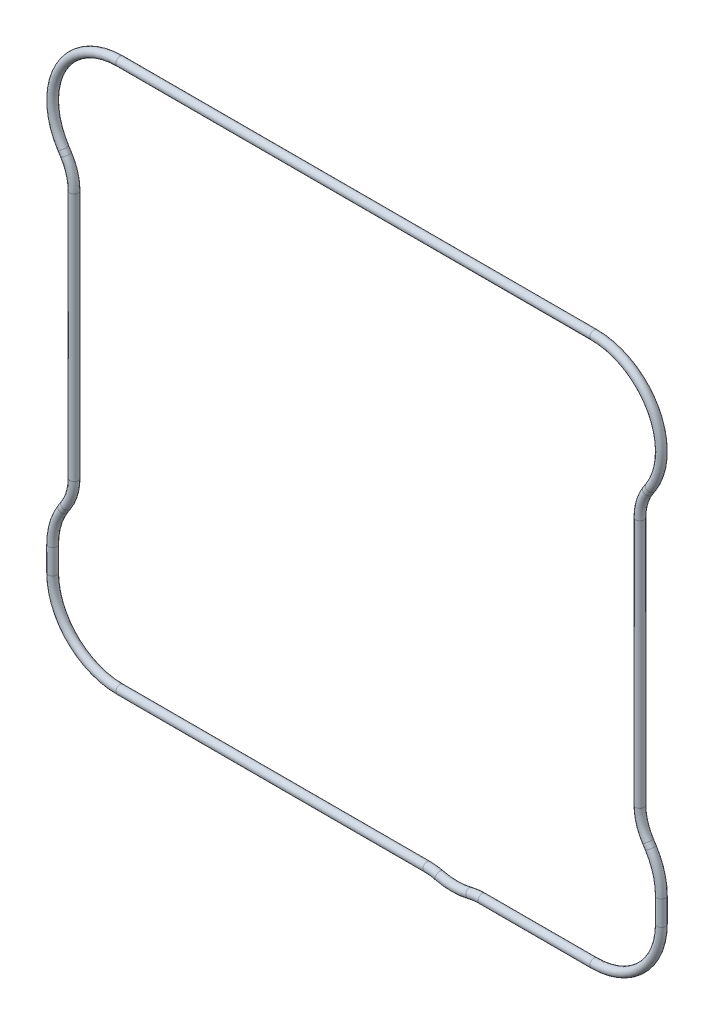
ISO-10303-21;
HEADER;
FILE_DESCRIPTION(('STEP AP214'),'2;1');
FILE_NAME('part.step','',(''),(''),'','','');
FILE_SCHEMA(('AUTOMOTIVE_DESIGN { 1 0 10303 214 1 1 1 1 }'));
ENDSEC;
DATA;
#1=APPLICATION_CONTEXT('core data for automotive mechanical design processes');
#2=APPLICATION_PROTOCOL_DEFINITION('international standard','automotive_design',2000,#1);
#3=PRODUCT_CONTEXT('',#1,'mechanical');
#4=PRODUCT('Part','Part','',(#3));
#5=PRODUCT_RELATED_PRODUCT_CATEGORY('part','',(#4));
#6=PRODUCT_DEFINITION_FORMATION('','',#4);
#7=PRODUCT_DEFINITION_CONTEXT('part definition',#1,'design');
#8=PRODUCT_DEFINITION('design','',#6,#7);
#9=PRODUCT_DEFINITION_SHAPE('','',#8);
#10=(LENGTH_UNIT() NAMED_UNIT(*) SI_UNIT(.MILLI.,.METRE.));
#11=(NAMED_UNIT(*) PLANE_ANGLE_UNIT() SI_UNIT($,.RADIAN.));
#12=(NAMED_UNIT(*) SI_UNIT($,.STERADIAN.) SOLID_ANGLE_UNIT());
#13=UNCERTAINTY_MEASURE_WITH_UNIT(LENGTH_MEASURE(1.E-05),#10,'distance_accuracy_value','');
#14=(GEOMETRIC_REPRESENTATION_CONTEXT(3) GLOBAL_UNCERTAINTY_ASSIGNED_CONTEXT((#13)) GLOBAL_UNIT_ASSIGNED_CONTEXT((#10,
#11,#12)) REPRESENTATION_CONTEXT('',''));
#15=CARTESIAN_POINT('',(0.,0.,0.));
#16=DIRECTION('',(0.,0.,1.));
#17=DIRECTION('',(1.,0.,0.));
#18=AXIS2_PLACEMENT_3D('',#15,#16,#17);
#19=CARTESIAN_POINT('',(119.575,44.6459755167523,0.));
#20=DIRECTION('',(0.,0.,1.));
#21=DIRECTION('',(1.,0.,0.));
#22=AXIS2_PLACEMENT_3D('',#19,#20,#21);
#23=TOROIDAL_SURFACE('',#22,18.1,1.5);
#24=CARTESIAN_POINT('',(104.331657726848,54.4056126177692,0.));
#25=DIRECTION('',(0.539206469669447,0.842173606251474,0.));
#26=DIRECTION('',(0.,0.,1.));
#27=AXIS2_PLACEMENT_3D('',#24,#25,#26);
#28=CIRCLE('',#27,1.5);
#29=CARTESIAN_POINT('',(103.068397317471,55.2144223222734,0.));
#30=VERTEX_POINT('',#29);
#31=EDGE_CURVE('E44',#30,#30,#28,.T.);
#32=CARTESIAN_POINT('',(101.475,44.6459755167522,0.));
#33=DIRECTION('',(0.,1.,0.));
#34=DIRECTION('',(0.,0.,1.));
#35=AXIS2_PLACEMENT_3D('',#32,#33,#34);
#36=CIRCLE('',#35,1.5);
#37=CARTESIAN_POINT('',(99.975,44.6459755167522,0.));
#38=VERTEX_POINT('',#37);
#39=EDGE_CURVE('E10',#38,#38,#36,.T.);
#40=CARTESIAN_POINT('',(119.575,44.6459755167523,0.));
#41=DIRECTION('',(0.,0.,1.));
#42=DIRECTION('',(1.,0.,0.));
#43=AXIS2_PLACEMENT_3D('',#40,#41,#42);
#44=CIRCLE('',#43,19.6);
#45=EDGE_CURVE('',#30,#38,#44,.T.);
#46=ORIENTED_EDGE('',*,*,#31,.F.);
#47=ORIENTED_EDGE('',*,*,#39,.T.);
#48=ORIENTED_EDGE('',*,*,#45,.T.);
#49=ORIENTED_EDGE('',*,*,#45,.F.);
#50=EDGE_LOOP('',(#46,#48,#47,#49));
#51=FACE_BOUND('',#50,.T.);
#52=ADVANCED_FACE('F38',(#51),#23,.T.);
#53=CARTESIAN_POINT('',(105.338492590973,55.9781637574828,0.));
#54=DIRECTION('',(-0.539206469669446,-0.842173606251474,0.));
#55=DIRECTION('',(0.842173606251474,-0.539206469669446,0.));
#56=AXIS2_PLACEMENT_3D('',#53,#54,#55);
#57=CYLINDRICAL_SURFACE('',#56,1.5);
#58=CARTESIAN_POINT('',(105.338492590973,55.9781637574828,0.));
#59=DIRECTION('',(0.539206469669447,0.842173606251474,0.));
#60=DIRECTION('',(0.,0.,1.));
#61=AXIS2_PLACEMENT_3D('',#58,#59,#60);
#62=CIRCLE('',#61,1.5);
#63=CARTESIAN_POINT('',(106.60175300035,55.1693540529786,0.));
#64=VERTEX_POINT('',#63);
#65=EDGE_CURVE('E48',#64,#64,#62,.T.);
#66=ORIENTED_EDGE('',*,*,#65,.F.);
#67=EDGE_LOOP('',(#66));
#68=FACE_BOUND('',#67,.T.);
#69=ORIENTED_EDGE('',*,*,#31,.T.);
#70=EDGE_LOOP('',(#69));
#71=FACE_BOUND('',#70,.T.);
#72=ADVANCED_FACE('F244',(#68,#71),#57,.T.);
#73=CARTESIAN_POINT('',(85.,69.,0.));
#74=DIRECTION('',(0.,0.,-1.));
#75=DIRECTION('',(-1.,0.,0.));
#76=AXIS2_PLACEMENT_3D('',#73,#74,#75);
#77=TOROIDAL_SURFACE('',#76,24.1499999999999,1.5);
#78=CARTESIAN_POINT('',(85.0000000000001,93.1499999999999,0.));
#79=DIRECTION('',(-1.,0.,0.));
#80=DIRECTION('',(0.,0.,1.));
#81=AXIS2_PLACEMENT_3D('',#78,#79,#80);
#82=CIRCLE('',#81,1.5);
#83=CARTESIAN_POINT('',(85.0000000000001,94.6499999999999,0.));
#84=VERTEX_POINT('',#83);
#85=EDGE_CURVE('E52',#84,#84,#82,.T.);
#86=CARTESIAN_POINT('',(85.,69.,0.));
#87=DIRECTION('',(0.,0.,-1.));
#88=DIRECTION('',(-1.,0.,0.));
#89=AXIS2_PLACEMENT_3D('',#86,#87,#88);
#90=CIRCLE('',#89,25.6499999999999);
#91=EDGE_CURVE('',#84,#64,#90,.T.);
#92=ORIENTED_EDGE('',*,*,#85,.F.);
#93=ORIENTED_EDGE('',*,*,#65,.T.);
#94=ORIENTED_EDGE('',*,*,#91,.T.);
#95=ORIENTED_EDGE('',*,*,#91,.F.);
#96=EDGE_LOOP('',(#92,#94,#93,#95));
#97=FACE_BOUND('',#96,.T.);
#98=ADVANCED_FACE('F238',(#97),#77,.T.);
#99=CARTESIAN_POINT('',(-84.9999999999999,93.1499999999999,0.));
#100=DIRECTION('',(1.,0.,0.));
#101=DIRECTION('',(0.,0.,-1.));
#102=AXIS2_PLACEMENT_3D('',#99,#100,#101);
#103=CYLINDRICAL_SURFACE('',#102,1.5);
#104=CARTESIAN_POINT('',(-84.9999999999999,93.1499999999999,0.));
#105=DIRECTION('',(-1.,0.,0.));
#106=DIRECTION('',(0.,0.,1.));
#107=AXIS2_PLACEMENT_3D('',#104,#105,#106);
#108=CIRCLE('',#107,1.5);
#109=CARTESIAN_POINT('',(-84.9999999999999,94.6499999999999,0.));
#110=VERTEX_POINT('',#109);
#111=EDGE_CURVE('E57',#110,#110,#108,.T.);
#112=ORIENTED_EDGE('',*,*,#111,.F.);
#113=EDGE_LOOP('',(#112));
#114=FACE_BOUND('',#113,.T.);
#115=ORIENTED_EDGE('',*,*,#85,.T.);
#116=EDGE_LOOP('',(#115));
#117=FACE_BOUND('',#116,.T.);
#118=ADVANCED_FACE('F232',(#114,#117),#103,.T.);
#119=CARTESIAN_POINT('',(-85.,69.,0.));
#120=DIRECTION('',(0.,0.,-1.));
#121=DIRECTION('',(-1.,0.,0.));
#122=AXIS2_PLACEMENT_3D('',#119,#120,#121);
#123=TOROIDAL_SURFACE('',#122,24.1499999999999,1.5);
#124=CARTESIAN_POINT('',(-105.338492590973,55.9781637574829,0.));
#125=DIRECTION('',(0.539206469669451,-0.842173606251471,0.));
#126=DIRECTION('',(0.,0.,1.));
#127=AXIS2_PLACEMENT_3D('',#124,#125,#126);
#128=CIRCLE('',#127,1.5);
#129=CARTESIAN_POINT('',(-106.60175300035,55.1693540529787,0.));
#130=VERTEX_POINT('',#129);
#131=EDGE_CURVE('E60',#130,#130,#128,.T.);
#132=CARTESIAN_POINT('',(-85.,69.,0.));
#133=DIRECTION('',(0.,0.,-1.));
#134=DIRECTION('',(-1.,0.,0.));
#135=AXIS2_PLACEMENT_3D('',#132,#133,#134);
#136=CIRCLE('',#135,25.6499999999999);
#137=EDGE_CURVE('',#130,#110,#136,.T.);
#138=ORIENTED_EDGE('',*,*,#131,.F.);
#139=ORIENTED_EDGE('',*,*,#111,.T.);
#140=ORIENTED_EDGE('',*,*,#137,.T.);
#141=ORIENTED_EDGE('',*,*,#137,.F.);
#142=EDGE_LOOP('',(#138,#140,#139,#141));
#143=FACE_BOUND('',#142,.T.);
#144=ADVANCED_FACE('F226',(#143),#123,.T.);
#145=CARTESIAN_POINT('',(-104.331657726848,54.4056126177694,0.));
#146=DIRECTION('',(-0.539206469669453,0.84217360625147,0.));
#147=DIRECTION('',(-0.84217360625147,-0.539206469669453,0.));
#148=AXIS2_PLACEMENT_3D('',#145,#146,#147);
#149=CYLINDRICAL_SURFACE('',#148,1.5);
#150=CARTESIAN_POINT('',(-104.331657726848,54.4056126177694,0.));
#151=DIRECTION('',(0.539206469669451,-0.842173606251471,0.));
#152=DIRECTION('',(0.,0.,1.));
#153=AXIS2_PLACEMENT_3D('',#150,#151,#152);
#154=CIRCLE('',#153,1.5);
#155=CARTESIAN_POINT('',(-103.068397317471,55.2144223222735,0.));
#156=VERTEX_POINT('',#155);
#157=EDGE_CURVE('E63',#156,#156,#154,.T.);
#158=ORIENTED_EDGE('',*,*,#157,.F.);
#159=EDGE_LOOP('',(#158));
#160=FACE_BOUND('',#159,.T.);
#161=ORIENTED_EDGE('',*,*,#131,.T.);
#162=EDGE_LOOP('',(#161));
#163=FACE_BOUND('',#162,.T.);
#164=ADVANCED_FACE('F220',(#160,#163),#149,.T.);
#165=CARTESIAN_POINT('',(-119.575,44.6459755167523,0.));
#166=DIRECTION('',(0.,0.,1.));
#167=DIRECTION('',(1.,0.,0.));
#168=AXIS2_PLACEMENT_3D('',#165,#166,#167);
#169=TOROIDAL_SURFACE('',#168,18.1000000000001,1.5);
#170=CARTESIAN_POINT('',(-101.475,44.6459755167523,0.));
#171=DIRECTION('',(0.,-1.,0.));
#172=DIRECTION('',(0.,0.,1.));
#173=AXIS2_PLACEMENT_3D('',#170,#171,#172);
#174=CIRCLE('',#173,1.5);
#175=CARTESIAN_POINT('',(-99.9749999999999,44.6459755167523,0.));
#176=VERTEX_POINT('',#175);
#177=EDGE_CURVE('E66',#176,#176,#174,.T.);
#178=CARTESIAN_POINT('',(-119.575,44.6459755167523,0.));
#179=DIRECTION('',(0.,0.,1.));
#180=DIRECTION('',(1.,0.,0.));
#181=AXIS2_PLACEMENT_3D('',#178,#179,#180);
#182=CIRCLE('',#181,19.6000000000001);
#183=EDGE_CURVE('',#176,#156,#182,.T.);
#184=ORIENTED_EDGE('',*,*,#177,.F.);
#185=ORIENTED_EDGE('',*,*,#157,.T.);
#186=ORIENTED_EDGE('',*,*,#183,.T.);
#187=ORIENTED_EDGE('',*,*,#183,.F.);
#188=EDGE_LOOP('',(#184,#186,#185,#187));
#189=FACE_BOUND('',#188,.T.);
#190=ADVANCED_FACE('F214',(#189),#169,.T.);
#191=CARTESIAN_POINT('',(-101.475,-44.6459755167522,0.));
#192=DIRECTION('',(0.,1.,0.));
#193=DIRECTION('',(-1.,0.,0.));
#194=AXIS2_PLACEMENT_3D('',#191,#192,#193);
#195=CYLINDRICAL_SURFACE('',#194,1.5);
#196=CARTESIAN_POINT('',(-101.475,-44.6459755167522,0.));
#197=DIRECTION('',(0.,-1.,0.));
#198=DIRECTION('',(0.,0.,1.));
#199=AXIS2_PLACEMENT_3D('',#196,#197,#198);
#200=CIRCLE('',#199,1.5);
#201=CARTESIAN_POINT('',(-99.975,-44.6459755167522,0.));
#202=VERTEX_POINT('',#201);
#203=EDGE_CURVE('E69',#202,#202,#200,.T.);
#204=ORIENTED_EDGE('',*,*,#203,.F.);
#205=EDGE_LOOP('',(#204));
#206=FACE_BOUND('',#205,.T.);
#207=ORIENTED_EDGE('',*,*,#177,.T.);
#208=EDGE_LOOP('',(#207));
#209=FACE_BOUND('',#208,.T.);
#210=ADVANCED_FACE('F208',(#206,#209),#195,.T.);
#211=CARTESIAN_POINT('',(-119.575,-44.6459755167523,0.));
#212=DIRECTION('',(0.,0.,1.));
#213=DIRECTION('',(1.,0.,0.));
#214=AXIS2_PLACEMENT_3D('',#211,#212,#213);
#215=TOROIDAL_SURFACE('',#214,18.1,1.5);
#216=CARTESIAN_POINT('',(-104.331657726848,-54.4056126177693,0.));
#217=DIRECTION('',(-0.539206469669446,-0.842173606251474,0.));
#218=DIRECTION('',(0.,0.,1.));
#219=AXIS2_PLACEMENT_3D('',#216,#217,#218);
#220=CIRCLE('',#219,1.5);
#221=CARTESIAN_POINT('',(-103.068397317471,-55.2144223222734,0.));
#222=VERTEX_POINT('',#221);
#223=EDGE_CURVE('E72',#222,#222,#220,.T.);
#224=CARTESIAN_POINT('',(-119.575,-44.6459755167523,0.));
#225=DIRECTION('',(0.,0.,1.));
#226=DIRECTION('',(1.,0.,0.));
#227=AXIS2_PLACEMENT_3D('',#224,#225,#226);
#228=CIRCLE('',#227,19.6);
#229=EDGE_CURVE('',#222,#202,#228,.T.);
#230=ORIENTED_EDGE('',*,*,#223,.F.);
#231=ORIENTED_EDGE('',*,*,#203,.T.);
#232=ORIENTED_EDGE('',*,*,#229,.T.);
#233=ORIENTED_EDGE('',*,*,#229,.F.);
#234=EDGE_LOOP('',(#230,#232,#231,#233));
#235=FACE_BOUND('',#234,.T.);
#236=ADVANCED_FACE('F202',(#235),#215,.T.);
#237=CARTESIAN_POINT('',(-105.338492590973,-55.9781637574828,0.));
#238=DIRECTION('',(0.539206469669449,0.842173606251472,0.));
#239=DIRECTION('',(-0.842173606251472,0.539206469669449,0.));
#240=AXIS2_PLACEMENT_3D('',#237,#238,#239);
#241=CYLINDRICAL_SURFACE('',#240,1.5);
#242=CARTESIAN_POINT('',(-105.338492590973,-55.9781637574828,0.));
#243=DIRECTION('',(-0.539206469669446,-0.842173606251474,0.));
#244=DIRECTION('',(0.,0.,1.));
#245=AXIS2_PLACEMENT_3D('',#242,#243,#244);
#246=CIRCLE('',#245,1.5);
#247=CARTESIAN_POINT('',(-106.60175300035,-55.1693540529786,0.));
#248=VERTEX_POINT('',#247);
#249=EDGE_CURVE('E75',#248,#248,#246,.T.);
#250=ORIENTED_EDGE('',*,*,#249,.F.);
#251=EDGE_LOOP('',(#250));
#252=FACE_BOUND('',#251,.T.);
#253=ORIENTED_EDGE('',*,*,#223,.T.);
#254=EDGE_LOOP('',(#253));
#255=FACE_BOUND('',#254,.T.);
#256=ADVANCED_FACE('F196',(#252,#255),#241,.T.);
#257=CARTESIAN_POINT('',(-85.,-69.,0.));
#258=DIRECTION('',(0.,0.,-1.));
#259=DIRECTION('',(-1.,0.,0.));
#260=AXIS2_PLACEMENT_3D('',#257,#258,#259);
#261=TOROIDAL_SURFACE('',#260,24.15,1.5);
#262=CARTESIAN_POINT('',(-109.15,-68.9999999999999,0.));
#263=DIRECTION('',(0.,-1.,0.));
#264=DIRECTION('',(0.,0.,1.));
#265=AXIS2_PLACEMENT_3D('',#262,#263,#264);
#266=CIRCLE('',#265,1.5);
#267=CARTESIAN_POINT('',(-110.65,-68.9999999999999,0.));
#268=VERTEX_POINT('',#267);
#269=EDGE_CURVE('E78',#268,#268,#266,.T.);
#270=CARTESIAN_POINT('',(-85.,-69.,0.));
#271=DIRECTION('',(0.,0.,-1.));
#272=DIRECTION('',(-1.,0.,0.));
#273=AXIS2_PLACEMENT_3D('',#270,#271,#272);
#274=CIRCLE('',#273,25.65);
#275=EDGE_CURVE('',#268,#248,#274,.T.);
#276=ORIENTED_EDGE('',*,*,#269,.F.);
#277=ORIENTED_EDGE('',*,*,#249,.T.);
#278=ORIENTED_EDGE('',*,*,#275,.T.);
#279=ORIENTED_EDGE('',*,*,#275,.F.);
#280=EDGE_LOOP('',(#276,#278,#277,#279));
#281=FACE_BOUND('',#280,.T.);
#282=ADVANCED_FACE('F190',(#281),#261,.T.);
#283=CARTESIAN_POINT('',(-109.15,-77.7999999999999,0.));
#284=DIRECTION('',(0.,1.,0.));
#285=DIRECTION('',(0.,0.,1.));
#286=AXIS2_PLACEMENT_3D('',#283,#284,#285);
#287=CYLINDRICAL_SURFACE('',#286,1.5);
#288=CARTESIAN_POINT('',(-109.15,-77.7999999999999,0.));
#289=DIRECTION('',(0.,-1.,0.));
#290=DIRECTION('',(0.,0.,1.));
#291=AXIS2_PLACEMENT_3D('',#288,#289,#290);
#292=CIRCLE('',#291,1.5);
#293=CARTESIAN_POINT('',(-110.65,-77.7999999999999,0.));
#294=VERTEX_POINT('',#293);
#295=EDGE_CURVE('E81',#294,#294,#292,.T.);
#296=ORIENTED_EDGE('',*,*,#295,.F.);
#297=EDGE_LOOP('',(#296));
#298=FACE_BOUND('',#297,.T.);
#299=ORIENTED_EDGE('',*,*,#269,.T.);
#300=EDGE_LOOP('',(#299));
#301=FACE_BOUND('',#300,.T.);
#302=ADVANCED_FACE('F184',(#298,#301),#287,.T.);
#303=CARTESIAN_POINT('',(-85.,-77.8,0.));
#304=DIRECTION('',(0.,0.,-1.));
#305=DIRECTION('',(-1.,0.,0.));
#306=AXIS2_PLACEMENT_3D('',#303,#304,#305);
#307=TOROIDAL_SURFACE('',#306,24.15,1.5);
#308=CARTESIAN_POINT('',(-85.,-101.95,0.));
#309=DIRECTION('',(1.,0.,0.));
#310=DIRECTION('',(0.,0.,1.));
#311=AXIS2_PLACEMENT_3D('',#308,#309,#310);
#312=CIRCLE('',#311,1.5);
#313=CARTESIAN_POINT('',(-85.,-103.45,0.));
#314=VERTEX_POINT('',#313);
#315=EDGE_CURVE('E84',#314,#314,#312,.T.);
#316=CARTESIAN_POINT('',(-85.,-77.8,0.));
#317=DIRECTION('',(0.,0.,-1.));
#318=DIRECTION('',(-1.,0.,0.));
#319=AXIS2_PLACEMENT_3D('',#316,#317,#318);
#320=CIRCLE('',#319,25.65);
#321=EDGE_CURVE('',#314,#294,#320,.T.);
#322=ORIENTED_EDGE('',*,*,#315,.F.);
#323=ORIENTED_EDGE('',*,*,#295,.T.);
#324=ORIENTED_EDGE('',*,*,#321,.T.);
#325=ORIENTED_EDGE('',*,*,#321,.F.);
#326=EDGE_LOOP('',(#322,#324,#323,#325));
#327=FACE_BOUND('',#326,.T.);
#328=ADVANCED_FACE('F178',(#327),#307,.T.);
#329=CARTESIAN_POINT('',(25.1227534201072,-101.95,0.));
#330=DIRECTION('',(-1.,0.,0.));
#331=DIRECTION('',(0.,-1.,0.));
#332=AXIS2_PLACEMENT_3D('',#329,#330,#331);
#333=CYLINDRICAL_SURFACE('',#332,1.5);
#334=CARTESIAN_POINT('',(25.1227534201072,-101.95,0.));
#335=DIRECTION('',(1.,0.,0.));
#336=DIRECTION('',(0.,0.,1.));
#337=AXIS2_PLACEMENT_3D('',#334,#335,#336);
#338=CIRCLE('',#337,1.5);
#339=CARTESIAN_POINT('',(25.1227534201072,-100.45,0.));
#340=VERTEX_POINT('',#339);
#341=EDGE_CURVE('E87',#340,#340,#338,.T.);
#342=ORIENTED_EDGE('',*,*,#341,.F.);
#343=EDGE_LOOP('',(#342));
#344=FACE_BOUND('',#343,.T.);
#345=ORIENTED_EDGE('',*,*,#315,.T.);
#346=EDGE_LOOP('',(#345));
#347=FACE_BOUND('',#346,.T.);
#348=ADVANCED_FACE('F172',(#344,#347),#333,.T.);
#349=CARTESIAN_POINT('',(25.1227534201073,-120.05,0.));
#350=DIRECTION('',(0.,0.,1.));
#351=DIRECTION('',(1.,0.,0.));
#352=AXIS2_PLACEMENT_3D('',#349,#350,#351);
#353=TOROIDAL_SURFACE('',#352,18.1,1.5);
#354=CARTESIAN_POINT('',(29.4567694951632,-102.476545454545,0.));
#355=DIRECTION('',(0.970909090909091,-0.239448401936791,0.));
#356=DIRECTION('',(0.,0.,1.));
#357=AXIS2_PLACEMENT_3D('',#354,#355,#356);
#358=CIRCLE('',#357,1.5);
#359=CARTESIAN_POINT('',(29.8159420980684,-101.020181818182,0.));
#360=VERTEX_POINT('',#359);
#361=EDGE_CURVE('E90',#360,#360,#358,.T.);
#362=CARTESIAN_POINT('',(25.1227534201073,-120.05,0.));
#363=DIRECTION('',(0.,0.,1.));
#364=DIRECTION('',(1.,0.,0.));
#365=AXIS2_PLACEMENT_3D('',#362,#363,#364);
#366=CIRCLE('',#365,19.6);
#367=EDGE_CURVE('',#360,#340,#366,.T.);
#368=ORIENTED_EDGE('',*,*,#361,.F.);
#369=ORIENTED_EDGE('',*,*,#341,.T.);
#370=ORIENTED_EDGE('',*,*,#367,.T.);
#371=ORIENTED_EDGE('',*,*,#367,.F.);
#372=EDGE_LOOP('',(#368,#370,#369,#371));
#373=FACE_BOUND('',#372,.T.);
#374=ADVANCED_FACE('F166',(#373),#353,.T.);
#375=CARTESIAN_POINT('',(35.,-80.,0.));
#376=DIRECTION('',(0.,0.,-1.));
#377=DIRECTION('',(-1.,0.,0.));
#378=AXIS2_PLACEMENT_3D('',#375,#376,#377);
#379=TOROIDAL_SURFACE('',#378,23.15,1.5);
#380=CARTESIAN_POINT('',(40.5432305048368,-102.476545454545,0.));
#381=DIRECTION('',(0.970909090909089,0.239448401936796,0.));
#382=DIRECTION('',(0.,0.,1.));
#383=AXIS2_PLACEMENT_3D('',#380,#381,#382);
#384=CIRCLE('',#383,1.5);
#385=CARTESIAN_POINT('',(40.1840579019316,-101.020181818182,0.));
#386=VERTEX_POINT('',#385);
#387=EDGE_CURVE('E93',#386,#386,#384,.T.);
#388=ORIENTED_EDGE('',*,*,#387,.F.);
#389=EDGE_LOOP('',(#388));
#390=FACE_BOUND('',#389,.T.);
#391=ORIENTED_EDGE('',*,*,#361,.T.);
#392=EDGE_LOOP('',(#391));
#393=FACE_BOUND('',#392,.T.);
#394=ADVANCED_FACE('F160',(#390,#393),#379,.T.);
#395=CARTESIAN_POINT('',(44.8772465798928,-120.05,0.));
#396=DIRECTION('',(0.,0.,1.));
#397=DIRECTION('',(1.,0.,0.));
#398=AXIS2_PLACEMENT_3D('',#395,#396,#397);
#399=TOROIDAL_SURFACE('',#398,18.1,1.5);
#400=CARTESIAN_POINT('',(44.8772465798928,-101.95,0.));
#401=DIRECTION('',(1.,0.,0.));
#402=DIRECTION('',(0.,0.,1.));
#403=AXIS2_PLACEMENT_3D('',#400,#401,#402);
#404=CIRCLE('',#403,1.5);
#405=CARTESIAN_POINT('',(44.8772465798928,-100.45,0.));
#406=VERTEX_POINT('',#405);
#407=EDGE_CURVE('E96',#406,#406,#404,.T.);
#408=CARTESIAN_POINT('',(44.8772465798928,-120.05,0.));
#409=DIRECTION('',(0.,0.,1.));
#410=DIRECTION('',(1.,0.,0.));
#411=AXIS2_PLACEMENT_3D('',#408,#409,#410);
#412=CIRCLE('',#411,19.6);
#413=EDGE_CURVE('',#406,#386,#412,.T.);
#414=ORIENTED_EDGE('',*,*,#407,.F.);
#415=ORIENTED_EDGE('',*,*,#387,.T.);
#416=ORIENTED_EDGE('',*,*,#413,.T.);
#417=ORIENTED_EDGE('',*,*,#413,.F.);
#418=EDGE_LOOP('',(#414,#416,#415,#417));
#419=FACE_BOUND('',#418,.T.);
#420=ADVANCED_FACE('F154',(#419),#399,.T.);
#421=CARTESIAN_POINT('',(85.,-101.95,0.));
#422=DIRECTION('',(-1.,0.,0.));
#423=DIRECTION('',(0.,-1.,0.));
#424=AXIS2_PLACEMENT_3D('',#421,#422,#423);
#425=CYLINDRICAL_SURFACE('',#424,1.5);
#426=CARTESIAN_POINT('',(85.,-101.95,0.));
#427=DIRECTION('',(1.,0.,0.));
#428=DIRECTION('',(0.,0.,1.));
#429=AXIS2_PLACEMENT_3D('',#426,#427,#428);
#430=CIRCLE('',#429,1.5);
#431=CARTESIAN_POINT('',(85.,-103.45,0.));
#432=VERTEX_POINT('',#431);
#433=EDGE_CURVE('E99',#432,#432,#430,.T.);
#434=ORIENTED_EDGE('',*,*,#433,.F.);
#435=EDGE_LOOP('',(#434));
#436=FACE_BOUND('',#435,.T.);
#437=ORIENTED_EDGE('',*,*,#407,.T.);
#438=EDGE_LOOP('',(#437));
#439=FACE_BOUND('',#438,.T.);
#440=ADVANCED_FACE('F148',(#436,#439),#425,.T.);
#441=CARTESIAN_POINT('',(85.,-77.8,0.));
#442=DIRECTION('',(0.,0.,-1.));
#443=DIRECTION('',(-1.,0.,0.));
#444=AXIS2_PLACEMENT_3D('',#441,#442,#443);
#445=TOROIDAL_SURFACE('',#444,24.15,1.5);
#446=CARTESIAN_POINT('',(109.15,-77.8,0.));
#447=DIRECTION('',(0.,1.,0.));
#448=DIRECTION('',(0.,0.,1.));
#449=AXIS2_PLACEMENT_3D('',#446,#447,#448);
#450=CIRCLE('',#449,1.5);
#451=CARTESIAN_POINT('',(110.65,-77.8,0.));
#452=VERTEX_POINT('',#451);
#453=EDGE_CURVE('E102',#452,#452,#450,.T.);
#454=CARTESIAN_POINT('',(85.,-77.8,0.));
#455=DIRECTION('',(0.,0.,-1.));
#456=DIRECTION('',(-1.,0.,0.));
#457=AXIS2_PLACEMENT_3D('',#454,#455,#456);
#458=CIRCLE('',#457,25.65);
#459=EDGE_CURVE('',#452,#432,#458,.T.);
#460=ORIENTED_EDGE('',*,*,#453,.F.);
#461=ORIENTED_EDGE('',*,*,#433,.T.);
#462=ORIENTED_EDGE('',*,*,#459,.T.);
#463=ORIENTED_EDGE('',*,*,#459,.F.);
#464=EDGE_LOOP('',(#460,#462,#461,#463));
#465=FACE_BOUND('',#464,.T.);
#466=ADVANCED_FACE('F142',(#465),#445,.T.);
#467=CARTESIAN_POINT('',(109.15,-69.,0.));
#468=DIRECTION('',(0.,-1.,0.));
#469=DIRECTION('',(0.,0.,-1.));
#470=AXIS2_PLACEMENT_3D('',#467,#468,#469);
#471=CYLINDRICAL_SURFACE('',#470,1.5);
#472=CARTESIAN_POINT('',(109.15,-69.,0.));
#473=DIRECTION('',(0.,1.,0.));
#474=DIRECTION('',(0.,0.,1.));
#475=AXIS2_PLACEMENT_3D('',#472,#473,#474);
#476=CIRCLE('',#475,1.5);
#477=CARTESIAN_POINT('',(110.65,-69.,0.));
#478=VERTEX_POINT('',#477);
#479=EDGE_CURVE('E105',#478,#478,#476,.T.);
#480=ORIENTED_EDGE('',*,*,#479,.F.);
#481=EDGE_LOOP('',(#480));
#482=FACE_BOUND('',#481,.T.);
#483=ORIENTED_EDGE('',*,*,#453,.T.);
#484=EDGE_LOOP('',(#483));
#485=FACE_BOUND('',#484,.T.);
#486=ADVANCED_FACE('F136',(#482,#485),#471,.T.);
#487=CARTESIAN_POINT('',(85.,-69.,0.));
#488=DIRECTION('',(0.,0.,-1.));
#489=DIRECTION('',(-1.,0.,0.));
#490=AXIS2_PLACEMENT_3D('',#487,#488,#489);
#491=TOROIDAL_SURFACE('',#490,24.15,1.5);
#492=CARTESIAN_POINT('',(105.338492590973,-55.9781637574828,0.));
#493=DIRECTION('',(-0.539206469669449,0.842173606251472,0.));
#494=DIRECTION('',(0.,0.,1.));
#495=AXIS2_PLACEMENT_3D('',#492,#493,#494);
#496=CIRCLE('',#495,1.5);
#497=CARTESIAN_POINT('',(106.60175300035,-55.1693540529786,0.));
#498=VERTEX_POINT('',#497);
#499=EDGE_CURVE('E108',#498,#498,#496,.T.);
#500=CARTESIAN_POINT('',(85.,-69.,0.));
#501=DIRECTION('',(0.,0.,-1.));
#502=DIRECTION('',(-1.,0.,0.));
#503=AXIS2_PLACEMENT_3D('',#500,#501,#502);
#504=CIRCLE('',#503,25.65);
#505=EDGE_CURVE('',#498,#478,#504,.T.);
#506=ORIENTED_EDGE('',*,*,#499,.F.);
#507=ORIENTED_EDGE('',*,*,#479,.T.);
#508=ORIENTED_EDGE('',*,*,#505,.T.);
#509=ORIENTED_EDGE('',*,*,#505,.F.);
#510=EDGE_LOOP('',(#506,#508,#507,#509));
#511=FACE_BOUND('',#510,.T.);
#512=ADVANCED_FACE('F130',(#511),#491,.T.);
#513=CARTESIAN_POINT('',(104.331657726848,-54.4056126177693,0.));
#514=DIRECTION('',(0.539206469669442,-0.842173606251476,0.));
#515=DIRECTION('',(0.842173606251476,0.539206469669443,0.));
#516=AXIS2_PLACEMENT_3D('',#513,#514,#515);
#517=CYLINDRICAL_SURFACE('',#516,1.5);
#518=CARTESIAN_POINT('',(104.331657726848,-54.4056126177693,0.));
#519=DIRECTION('',(-0.539206469669449,0.842173606251472,0.));
#520=DIRECTION('',(0.,0.,1.));
#521=AXIS2_PLACEMENT_3D('',#518,#519,#520);
#522=CIRCLE('',#521,1.5);
#523=CARTESIAN_POINT('',(103.068397317471,-55.2144223222734,0.));
#524=VERTEX_POINT('',#523);
#525=EDGE_CURVE('E111',#524,#524,#522,.T.);
#526=ORIENTED_EDGE('',*,*,#525,.F.);
#527=EDGE_LOOP('',(#526));
#528=FACE_BOUND('',#527,.T.);
#529=ORIENTED_EDGE('',*,*,#499,.T.);
#530=EDGE_LOOP('',(#529));
#531=FACE_BOUND('',#530,.T.);
#532=ADVANCED_FACE('F124',(#528,#531),#517,.T.);
#533=CARTESIAN_POINT('',(119.575,-44.6459755167523,0.));
#534=DIRECTION('',(0.,0.,1.));
#535=DIRECTION('',(1.,0.,0.));
#536=AXIS2_PLACEMENT_3D('',#533,#534,#535);
#537=TOROIDAL_SURFACE('',#536,18.1,1.5);
#538=CARTESIAN_POINT('',(101.475,-44.6459755167523,0.));
#539=DIRECTION('',(0.,1.,0.));
#540=DIRECTION('',(0.,0.,1.));
#541=AXIS2_PLACEMENT_3D('',#538,#539,#540);
#542=CIRCLE('',#541,1.5);
#543=CARTESIAN_POINT('',(99.975,-44.6459755167523,0.));
#544=VERTEX_POINT('',#543);
#545=EDGE_CURVE('E114',#544,#544,#542,.T.);
#546=CARTESIAN_POINT('',(119.575,-44.6459755167523,0.));
#547=DIRECTION('',(0.,0.,1.));
#548=DIRECTION('',(1.,0.,0.));
#549=AXIS2_PLACEMENT_3D('',#546,#547,#548);
#550=CIRCLE('',#549,19.6);
#551=EDGE_CURVE('',#544,#524,#550,.T.);
#552=ORIENTED_EDGE('',*,*,#545,.F.);
#553=ORIENTED_EDGE('',*,*,#525,.T.);
#554=ORIENTED_EDGE('',*,*,#551,.T.);
#555=ORIENTED_EDGE('',*,*,#551,.F.);
#556=EDGE_LOOP('',(#552,#554,#553,#555));
#557=FACE_BOUND('',#556,.T.);
#558=ADVANCED_FACE('F121',(#557),#537,.T.);
#559=CARTESIAN_POINT('',(101.475,-44.6459755167523,0.));
#560=DIRECTION('',(0.,1.,0.));
#561=DIRECTION('',(0.,0.,1.));
#562=AXIS2_PLACEMENT_3D('',#559,#560,#561);
#563=CYLINDRICAL_SURFACE('',#562,1.5);
#564=ORIENTED_EDGE('',*,*,#545,.T.);
#565=EDGE_LOOP('',(#564));
#566=FACE_BOUND('',#565,.T.);
#567=ORIENTED_EDGE('',*,*,#39,.F.);
#568=EDGE_LOOP('',(#567));
#569=FACE_BOUND('',#568,.T.);
#570=ADVANCED_FACE('F118',(#566,#569),#563,.T.);
#571=CLOSED_SHELL('',(#52,#72,#98,#118,#144,#164,#190,#210,#236,#256,#282,#302,#328,#348,#374,
#394,#420,#440,#466,#486,#512,#532,#558,#570));
#572=MANIFOLD_SOLID_BREP('B2',#571);
#573=ADVANCED_BREP_SHAPE_REPRESENTATION('',(#18,#572),#14);
#574=SHAPE_DEFINITION_REPRESENTATION(#9,#573);
ENDSEC;
END-ISO-10303-21;
